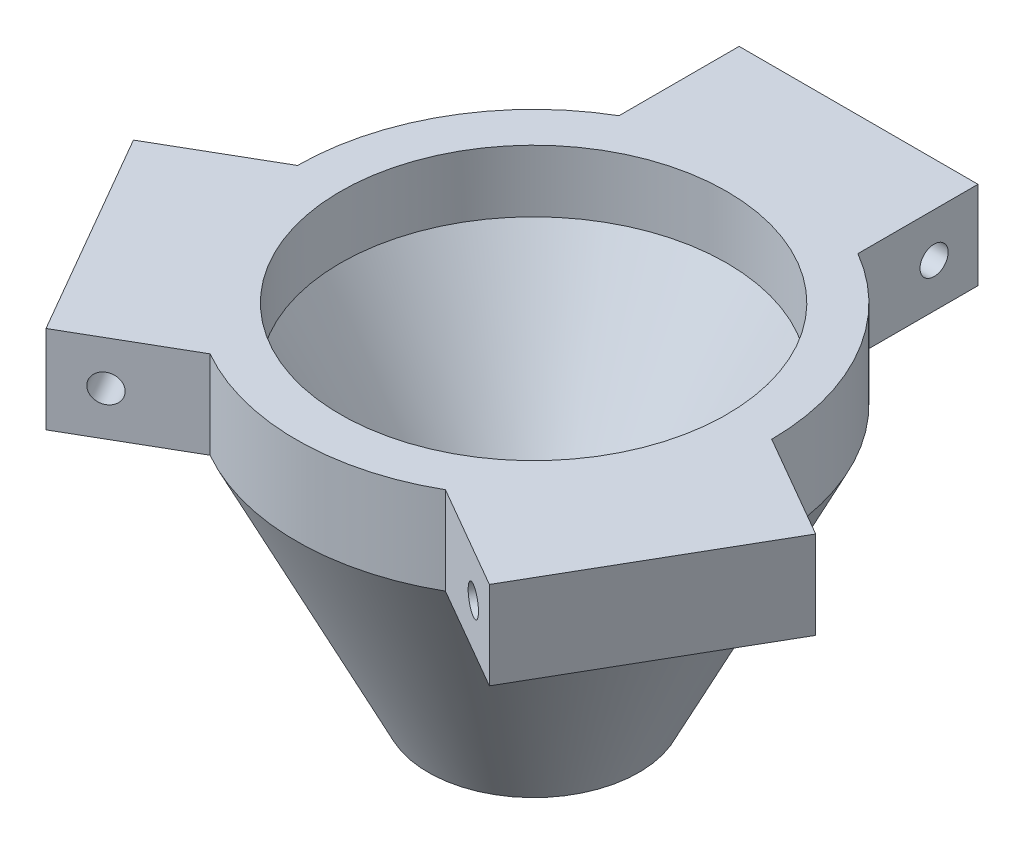
ISO-10303-21;
HEADER;
FILE_DESCRIPTION(('STEP AP214'),'2;1');
FILE_NAME('part.step','',(''),(''),'','','');
FILE_SCHEMA(('AUTOMOTIVE_DESIGN { 1 0 10303 214 1 1 1 1 }'));
ENDSEC;
DATA;
#1=APPLICATION_CONTEXT('core data for automotive mechanical design processes');
#2=APPLICATION_PROTOCOL_DEFINITION('international standard','automotive_design',2000,#1);
#3=PRODUCT_CONTEXT('',#1,'mechanical');
#4=PRODUCT('Part','Part','',(#3));
#5=PRODUCT_RELATED_PRODUCT_CATEGORY('part','',(#4));
#6=PRODUCT_DEFINITION_FORMATION('','',#4);
#7=PRODUCT_DEFINITION_CONTEXT('part definition',#1,'design');
#8=PRODUCT_DEFINITION('design','',#6,#7);
#9=PRODUCT_DEFINITION_SHAPE('','',#8);
#10=(LENGTH_UNIT() NAMED_UNIT(*) SI_UNIT(.MILLI.,.METRE.));
#11=(NAMED_UNIT(*) PLANE_ANGLE_UNIT() SI_UNIT($,.RADIAN.));
#12=(NAMED_UNIT(*) SI_UNIT($,.STERADIAN.) SOLID_ANGLE_UNIT());
#13=UNCERTAINTY_MEASURE_WITH_UNIT(LENGTH_MEASURE(1.E-05),#10,'distance_accuracy_value','');
#14=(GEOMETRIC_REPRESENTATION_CONTEXT(3) GLOBAL_UNCERTAINTY_ASSIGNED_CONTEXT((#13)) GLOBAL_UNIT_ASSIGNED_CONTEXT((#10,
#11,#12)) REPRESENTATION_CONTEXT('',''));
#15=CARTESIAN_POINT('',(0.,0.,0.));
#16=DIRECTION('',(0.,0.,1.));
#17=DIRECTION('',(1.,0.,0.));
#18=AXIS2_PLACEMENT_3D('',#15,#16,#17);
#19=CARTESIAN_POINT('',(0.,0.,0.));
#20=DIRECTION('',(0.,-1.,0.));
#21=DIRECTION('',(0.,0.,-1.));
#22=AXIS2_PLACEMENT_3D('',#19,#20,#21);
#23=CYLINDRICAL_SURFACE('',#22,27.);
#24=CARTESIAN_POINT('',(0.,40.3,0.));
#25=DIRECTION('',(0.,-1.,0.));
#26=DIRECTION('',(0.,0.,-1.));
#27=AXIS2_PLACEMENT_3D('',#24,#25,#26);
#28=CIRCLE('',#27,27.);
#29=CARTESIAN_POINT('',(13.3997524737308,40.3,23.4402780197408));
#30=VERTEX_POINT('',#29);
#31=CARTESIAN_POINT('',(-13.3997524737312,40.3,23.4402780197406));
#32=VERTEX_POINT('',#31);
#33=EDGE_CURVE('E219',#30,#32,#28,.T.);
#34=ORIENTED_EDGE('',*,*,#33,.T.);
#35=DIRECTION('',(0.,-1.,0.));
#36=VECTOR('',#35,1.);
#37=CARTESIAN_POINT('',(-13.3997524737312,0.,23.4402780197406));
#38=LINE('',#37,#36);
#39=CARTESIAN_POINT('',(-13.3997524737312,30.3,23.4402780197406));
#40=VERTEX_POINT('',#39);
#41=EDGE_CURVE('E73',#32,#40,#38,.T.);
#42=ORIENTED_EDGE('',*,*,#41,.T.);
#43=CARTESIAN_POINT('',(0.,30.3,0.));
#44=DIRECTION('',(0.,-1.,0.));
#45=DIRECTION('',(0.,0.,-1.));
#46=AXIS2_PLACEMENT_3D('',#43,#44,#45);
#47=CIRCLE('',#46,27.);
#48=CARTESIAN_POINT('',(13.3997524737308,30.3,23.4402780197408));
#49=VERTEX_POINT('',#48);
#50=EDGE_CURVE('E323',#49,#40,#47,.T.);
#51=ORIENTED_EDGE('',*,*,#50,.F.);
#52=DIRECTION('',(0.,-1.,0.));
#53=VECTOR('',#52,1.);
#54=CARTESIAN_POINT('',(13.3997524737308,0.,23.4402780197408));
#55=LINE('',#54,#53);
#56=EDGE_CURVE('E244',#49,#30,#55,.F.);
#57=ORIENTED_EDGE('',*,*,#56,.T.);
#58=EDGE_LOOP('',(#34,#42,#51,#57));
#59=FACE_BOUND('',#58,.T.);
#60=ADVANCED_FACE('F48',(#59),#23,.T.);
#61=CARTESIAN_POINT('',(13.6,40.3,-23.3246650565448));
#62=VERTEX_POINT('',#61);
#63=CARTESIAN_POINT('',(26.999752473731,40.3,-0.115612963195866));
#64=VERTEX_POINT('',#63);
#65=EDGE_CURVE('E187',#62,#64,#28,.T.);
#66=ORIENTED_EDGE('',*,*,#65,.T.);
#67=DIRECTION('',(0.,-1.,0.));
#68=VECTOR('',#67,1.);
#69=CARTESIAN_POINT('',(26.999752473731,0.,-0.115612963195866));
#70=LINE('',#69,#68);
#71=CARTESIAN_POINT('',(26.999752473731,30.3,-0.115612963195866));
#72=VERTEX_POINT('',#71);
#73=EDGE_CURVE('E249',#64,#72,#70,.T.);
#74=ORIENTED_EDGE('',*,*,#73,.T.);
#75=CARTESIAN_POINT('',(13.6,30.3,-23.3246650565448));
#76=VERTEX_POINT('',#75);
#77=EDGE_CURVE('E181',#76,#72,#47,.T.);
#78=ORIENTED_EDGE('',*,*,#77,.F.);
#79=DIRECTION('',(0.,-1.,0.));
#80=VECTOR('',#79,1.);
#81=CARTESIAN_POINT('',(13.6,0.,-23.3246650565448));
#82=LINE('',#81,#80);
#83=EDGE_CURVE('E269',#76,#62,#82,.F.);
#84=ORIENTED_EDGE('',*,*,#83,.T.);
#85=EDGE_LOOP('',(#66,#74,#78,#84));
#86=FACE_BOUND('',#85,.T.);
#87=ADVANCED_FACE('F300',(#86),#23,.T.);
#88=CARTESIAN_POINT('',(0.,0.,0.));
#89=DIRECTION('',(0.,-1.,0.));
#90=DIRECTION('',(0.,0.,-1.));
#91=AXIS2_PLACEMENT_3D('',#88,#89,#90);
#92=CYLINDRICAL_SURFACE('',#91,6.);
#93=CARTESIAN_POINT('',(0.,7.25479393551143,0.));
#94=DIRECTION('',(0.,-1.,0.));
#95=DIRECTION('',(0.,0.,-1.));
#96=AXIS2_PLACEMENT_3D('',#93,#94,#95);
#97=CIRCLE('',#96,6.);
#98=CARTESIAN_POINT('',(0.,7.25479393551143,6.));
#99=VERTEX_POINT('',#98);
#100=EDGE_CURVE('E276',#99,#99,#97,.T.);
#101=ORIENTED_EDGE('',*,*,#100,.F.);
#102=EDGE_LOOP('',(#101));
#103=FACE_BOUND('',#102,.T.);
#104=CARTESIAN_POINT('',(0.,0.,0.));
#105=DIRECTION('',(0.,-1.,0.));
#106=DIRECTION('',(0.,0.,-1.));
#107=AXIS2_PLACEMENT_3D('',#104,#105,#106);
#108=CIRCLE('',#107,6.);
#109=CARTESIAN_POINT('',(0.,0.,-6.));
#110=VERTEX_POINT('',#109);
#111=EDGE_CURVE('E12',#110,#110,#108,.T.);
#112=ORIENTED_EDGE('',*,*,#111,.T.);
#113=EDGE_LOOP('',(#112));
#114=FACE_BOUND('',#113,.T.);
#115=ADVANCED_FACE('F50',(#103,#114),#92,.F.);
#116=CARTESIAN_POINT('',(-6.,0.,0.));
#117=DIRECTION('',(0.,1.,0.));
#118=DIRECTION('',(0.,0.,1.));
#119=AXIS2_PLACEMENT_3D('',#116,#117,#118);
#120=PLANE('',#119);
#121=ORIENTED_EDGE('',*,*,#111,.F.);
#122=EDGE_LOOP('',(#121));
#123=FACE_BOUND('',#122,.T.);
#124=CARTESIAN_POINT('',(0.,0.,0.));
#125=DIRECTION('',(0.,-1.,0.));
#126=DIRECTION('',(0.,0.,-1.));
#127=AXIS2_PLACEMENT_3D('',#124,#125,#126);
#128=CIRCLE('',#127,12.);
#129=CARTESIAN_POINT('',(0.,0.,-12.));
#130=VERTEX_POINT('',#129);
#131=EDGE_CURVE('E57',#130,#130,#128,.T.);
#132=ORIENTED_EDGE('',*,*,#131,.T.);
#133=EDGE_LOOP('',(#132));
#134=FACE_BOUND('',#133,.T.);
#135=ADVANCED_FACE('F299',(#123,#134),#120,.F.);
#136=CARTESIAN_POINT('',(0.,30.3,0.));
#137=DIRECTION('',(0.,1.,0.));
#138=DIRECTION('',(0.,0.,1.));
#139=AXIS2_PLACEMENT_3D('',#136,#137,#138);
#140=CONICAL_SURFACE('',#139,27.,0.459679375861773);
#141=ORIENTED_EDGE('',*,*,#131,.F.);
#142=EDGE_LOOP('',(#141));
#143=FACE_BOUND('',#142,.T.);
#144=ORIENTED_EDGE('',*,*,#77,.T.);
#145=EDGE_CURVE('E185',#72,#49,#47,.T.);
#146=ORIENTED_EDGE('',*,*,#145,.T.);
#147=ORIENTED_EDGE('',*,*,#50,.T.);
#148=CARTESIAN_POINT('',(-26.999752473731,30.3,-0.115612963196236));
#149=VERTEX_POINT('',#148);
#150=EDGE_CURVE('E336',#40,#149,#47,.T.);
#151=ORIENTED_EDGE('',*,*,#150,.T.);
#152=CARTESIAN_POINT('',(-13.6,30.3,-23.3246650565448));
#153=VERTEX_POINT('',#152);
#154=EDGE_CURVE('E65',#149,#153,#47,.T.);
#155=ORIENTED_EDGE('',*,*,#154,.T.);
#156=EDGE_CURVE('E186',#153,#76,#47,.T.);
#157=ORIENTED_EDGE('',*,*,#156,.T.);
#158=EDGE_LOOP('',(#144,#146,#147,#151,#155,#157));
#159=FACE_BOUND('',#158,.T.);
#160=ADVANCED_FACE('F305',(#143,#159),#140,.T.);
#161=ORIENTED_EDGE('',*,*,#154,.F.);
#162=DIRECTION('',(0.,-1.,0.));
#163=VECTOR('',#162,1.);
#164=CARTESIAN_POINT('',(-26.999752473731,0.,-0.115612963196237));
#165=LINE('',#164,#163);
#166=CARTESIAN_POINT('',(-26.999752473731,40.3,-0.115612963196233));
#167=VERTEX_POINT('',#166);
#168=EDGE_CURVE('E147',#149,#167,#165,.F.);
#169=ORIENTED_EDGE('',*,*,#168,.T.);
#170=CARTESIAN_POINT('',(-13.6,40.3,-23.3246650565448));
#171=VERTEX_POINT('',#170);
#172=EDGE_CURVE('E215',#167,#171,#28,.T.);
#173=ORIENTED_EDGE('',*,*,#172,.T.);
#174=DIRECTION('',(0.,-1.,0.));
#175=VECTOR('',#174,1.);
#176=CARTESIAN_POINT('',(-13.6,0.,-23.3246650565448));
#177=LINE('',#176,#175);
#178=EDGE_CURVE('E274',#171,#153,#177,.T.);
#179=ORIENTED_EDGE('',*,*,#178,.T.);
#180=EDGE_LOOP('',(#161,#169,#173,#179));
#181=FACE_BOUND('',#180,.T.);
#182=ADVANCED_FACE('F221',(#181),#23,.T.);
#183=CARTESIAN_POINT('',(-27.,40.3,0.));
#184=DIRECTION('',(0.,-1.,0.));
#185=DIRECTION('',(0.,0.,-1.));
#186=AXIS2_PLACEMENT_3D('',#183,#184,#185);
#187=PLANE('',#186);
#188=ORIENTED_EDGE('',*,*,#172,.F.);
#189=DIRECTION('',(-0.866025403784443,0.,0.499999999999992));
#190=VECTOR('',#189,1.);
#191=CARTESIAN_POINT('',(-38.8429399400243,40.3,6.72205450853127));
#192=LINE('',#191,#190);
#193=CARTESIAN_POINT('',(-38.8429399400243,40.3,6.72205450853127));
#194=VERTEX_POINT('',#193);
#195=EDGE_CURVE('E170',#167,#194,#192,.T.);
#196=ORIENTED_EDGE('',*,*,#195,.T.);
#197=DIRECTION('',(0.499999999999992,0.,0.866025403784443));
#198=VECTOR('',#197,1.);
#199=CARTESIAN_POINT('',(-25.2429399400245,40.3,30.2779454914681));
#200=LINE('',#199,#198);
#201=CARTESIAN_POINT('',(-25.2429399400245,40.3,30.2779454914681));
#202=VERTEX_POINT('',#201);
#203=EDGE_CURVE('E158',#194,#202,#200,.T.);
#204=ORIENTED_EDGE('',*,*,#203,.T.);
#205=DIRECTION('',(0.866025403784443,0.,-0.499999999999992));
#206=VECTOR('',#205,1.);
#207=CARTESIAN_POINT('',(-25.2429399400245,40.3,30.2779454914681));
#208=LINE('',#207,#206);
#209=EDGE_CURVE('E167',#202,#32,#208,.T.);
#210=ORIENTED_EDGE('',*,*,#209,.T.);
#211=ORIENTED_EDGE('',*,*,#33,.F.);
#212=DIRECTION('',(0.866025403784436,0.,0.500000000000004));
#213=VECTOR('',#212,1.);
#214=CARTESIAN_POINT('',(25.2429399400241,40.3,30.2779454914685));
#215=LINE('',#214,#213);
#216=CARTESIAN_POINT('',(25.2429399400241,40.3,30.2779454914685));
#217=VERTEX_POINT('',#216);
#218=EDGE_CURVE('E238',#30,#217,#215,.T.);
#219=ORIENTED_EDGE('',*,*,#218,.T.);
#220=DIRECTION('',(0.500000000000004,0.,-0.866025403784436));
#221=VECTOR('',#220,1.);
#222=CARTESIAN_POINT('',(38.8429399400242,40.3,6.72205450853182));
#223=LINE('',#222,#221);
#224=CARTESIAN_POINT('',(38.8429399400242,40.3,6.72205450853182));
#225=VERTEX_POINT('',#224);
#226=EDGE_CURVE('E230',#217,#225,#223,.T.);
#227=ORIENTED_EDGE('',*,*,#226,.T.);
#228=DIRECTION('',(-0.866025403784437,0.,-0.500000000000004));
#229=VECTOR('',#228,1.);
#230=CARTESIAN_POINT('',(38.8429399400242,40.3,6.72205450853182));
#231=LINE('',#230,#229);
#232=EDGE_CURVE('E223',#225,#64,#231,.T.);
#233=ORIENTED_EDGE('',*,*,#232,.T.);
#234=ORIENTED_EDGE('',*,*,#65,.F.);
#235=DIRECTION('',(0.,0.,-1.));
#236=VECTOR('',#235,1.);
#237=CARTESIAN_POINT('',(13.6,40.3,-37.));
#238=LINE('',#237,#236);
#239=CARTESIAN_POINT('',(13.6,40.3,-37.));
#240=VERTEX_POINT('',#239);
#241=EDGE_CURVE('E264',#62,#240,#238,.T.);
#242=ORIENTED_EDGE('',*,*,#241,.T.);
#243=DIRECTION('',(-1.,0.,0.));
#244=VECTOR('',#243,1.);
#245=CARTESIAN_POINT('',(-13.6,40.3,-37.));
#246=LINE('',#245,#244);
#247=CARTESIAN_POINT('',(-13.6,40.3,-37.));
#248=VERTEX_POINT('',#247);
#249=EDGE_CURVE('E257',#240,#248,#246,.T.);
#250=ORIENTED_EDGE('',*,*,#249,.T.);
#251=DIRECTION('',(0.,0.,1.));
#252=VECTOR('',#251,1.);
#253=CARTESIAN_POINT('',(-13.6,40.3,-37.));
#254=LINE('',#253,#252);
#255=EDGE_CURVE('E195',#248,#171,#254,.T.);
#256=ORIENTED_EDGE('',*,*,#255,.T.);
#257=EDGE_LOOP('',(#188,#196,#204,#210,#211,#219,#227,#233,#234,#242,#250,#256));
#258=FACE_BOUND('',#257,.T.);
#259=CARTESIAN_POINT('',(0.,40.3,0.));
#260=DIRECTION('',(0.,-1.,0.));
#261=DIRECTION('',(0.,0.,-1.));
#262=AXIS2_PLACEMENT_3D('',#259,#260,#261);
#263=CIRCLE('',#262,22.);
#264=CARTESIAN_POINT('',(0.,40.3,-22.));
#265=VERTEX_POINT('',#264);
#266=EDGE_CURVE('E220',#265,#265,#263,.T.);
#267=ORIENTED_EDGE('',*,*,#266,.T.);
#268=EDGE_LOOP('',(#267));
#269=FACE_BOUND('',#268,.T.);
#270=ADVANCED_FACE('F212',(#258,#269),#187,.F.);
#271=CARTESIAN_POINT('',(0.,0.,0.));
#272=DIRECTION('',(0.,-1.,0.));
#273=DIRECTION('',(0.,0.,-1.));
#274=AXIS2_PLACEMENT_3D('',#271,#272,#273);
#275=CYLINDRICAL_SURFACE('',#274,22.);
#276=ORIENTED_EDGE('',*,*,#266,.F.);
#277=EDGE_LOOP('',(#276));
#278=FACE_BOUND('',#277,.T.);
#279=CARTESIAN_POINT('',(0.,33.2371899423447,0.));
#280=DIRECTION('',(0.,-1.,0.));
#281=DIRECTION('',(0.,0.,-1.));
#282=AXIS2_PLACEMENT_3D('',#279,#280,#281);
#283=CIRCLE('',#282,22.);
#284=CARTESIAN_POINT('',(0.,33.2371899423447,22.));
#285=VERTEX_POINT('',#284);
#286=EDGE_CURVE('E279',#285,#285,#283,.T.);
#287=ORIENTED_EDGE('',*,*,#286,.T.);
#288=EDGE_LOOP('',(#287));
#289=FACE_BOUND('',#288,.T.);
#290=ADVANCED_FACE('F284',(#278,#289),#275,.F.);
#291=CARTESIAN_POINT('',(0.,7.25479393551143,0.));
#292=DIRECTION('',(0.,1.,0.));
#293=DIRECTION('',(0.,0.,1.));
#294=AXIS2_PLACEMENT_3D('',#291,#292,#293);
#295=CONICAL_SURFACE('',#294,6.,0.551957345484303);
#296=CARTESIAN_POINT('',(0.,33.2371899423447,22.));
#297=CARTESIAN_POINT('',(0.,32.9665399839402,21.8333333333333));
#298=CARTESIAN_POINT('',(0.,32.6958900255356,21.6666666666667));
#299=CARTESIAN_POINT('',(0.,32.1545901087266,21.3333333333333));
#300=CARTESIAN_POINT('',(0.,31.8839401503221,21.1666666666667));
#301=CARTESIAN_POINT('',(0.,31.3426402335131,20.8333333333333));
#302=CARTESIAN_POINT('',(0.,31.0719902751086,20.6666666666667));
#303=CARTESIAN_POINT('',(0.,30.5306903582995,20.3333333333333));
#304=CARTESIAN_POINT('',(0.,30.260040399895,20.1666666666667));
#305=CARTESIAN_POINT('',(0.,29.718740483086,19.8333333333333));
#306=CARTESIAN_POINT('',(0.,29.4480905246815,19.6666666666667));
#307=CARTESIAN_POINT('',(0.,28.9067906078725,19.3333333333333));
#308=CARTESIAN_POINT('',(0.,28.636140649468,19.1666666666667));
#309=CARTESIAN_POINT('',(0.,28.0948407326589,18.8333333333333));
#310=CARTESIAN_POINT('',(0.,27.8241907742544,18.6666666666667));
#311=CARTESIAN_POINT('',(0.,27.2828908574454,18.3333333333333));
#312=CARTESIAN_POINT('',(0.,27.0122408990409,18.1666666666667));
#313=CARTESIAN_POINT('',(0.,26.4709409822318,17.8333333333333));
#314=CARTESIAN_POINT('',(0.,26.2002910238273,17.6666666666667));
#315=CARTESIAN_POINT('',(0.,25.6589911070183,17.3333333333333));
#316=CARTESIAN_POINT('',(0.,25.3883411486138,17.1666666666667));
#317=CARTESIAN_POINT('',(0.,24.8470412318048,16.8333333333333));
#318=CARTESIAN_POINT('',(0.,24.5763912734003,16.6666666666667));
#319=CARTESIAN_POINT('',(0.,24.0350913565912,16.3333333333333));
#320=CARTESIAN_POINT('',(0.,23.7644413981867,16.1666666666667));
#321=CARTESIAN_POINT('',(0.,23.2231414813777,15.8333333333333));
#322=CARTESIAN_POINT('',(0.,22.9524915229732,15.6666666666667));
#323=CARTESIAN_POINT('',(0.,22.4111916061642,15.3333333333333));
#324=CARTESIAN_POINT('',(0.,22.1405416477596,15.1666666666667));
#325=CARTESIAN_POINT('',(0.,21.5992417309506,14.8333333333333));
#326=CARTESIAN_POINT('',(0.,21.3285917725461,14.6666666666667));
#327=CARTESIAN_POINT('',(0.,20.7872918557371,14.3333333333333));
#328=CARTESIAN_POINT('',(0.,20.5166418973326,14.1666666666667));
#329=CARTESIAN_POINT('',(0.,19.9753419805235,13.8333333333333));
#330=CARTESIAN_POINT('',(0.,19.704692022119,13.6666666666667));
#331=CARTESIAN_POINT('',(0.,19.16339210531,13.3333333333333));
#332=CARTESIAN_POINT('',(0.,18.8927421469055,13.1666666666667));
#333=CARTESIAN_POINT('',(0.,18.3514422300965,12.8333333333333));
#334=CARTESIAN_POINT('',(0.,18.0807922716919,12.6666666666667));
#335=CARTESIAN_POINT('',(0.,17.5394923548829,12.3333333333333));
#336=CARTESIAN_POINT('',(0.,17.2688423964784,12.1666666666667));
#337=CARTESIAN_POINT('',(0.,16.7275424796694,11.8333333333333));
#338=CARTESIAN_POINT('',(0.,16.4568925212649,11.6666666666667));
#339=CARTESIAN_POINT('',(0.,15.9155926044558,11.3333333333333));
#340=CARTESIAN_POINT('',(0.,15.6449426460513,11.1666666666667));
#341=CARTESIAN_POINT('',(0.,15.1036427292423,10.8333333333333));
#342=CARTESIAN_POINT('',(0.,14.8329927708378,10.6666666666667));
#343=CARTESIAN_POINT('',(0.,14.2916928540288,10.3333333333333));
#344=CARTESIAN_POINT('',(0.,14.0210428956242,10.1666666666667));
#345=CARTESIAN_POINT('',(0.,13.4797429788152,9.83333333333333));
#346=CARTESIAN_POINT('',(0.,13.2090930204107,9.66666666666667));
#347=CARTESIAN_POINT('',(0.,12.6677931036017,9.33333333333333));
#348=CARTESIAN_POINT('',(0.,12.3971431451972,9.16666666666667));
#349=CARTESIAN_POINT('',(0.,11.8558432283881,8.83333333333333));
#350=CARTESIAN_POINT('',(0.,11.5851932699836,8.66666666666667));
#351=CARTESIAN_POINT('',(0.,11.0438933531746,8.33333333333333));
#352=CARTESIAN_POINT('',(0.,10.7732433947701,8.16666666666667));
#353=CARTESIAN_POINT('',(0.,10.2319434779611,7.83333333333333));
#354=CARTESIAN_POINT('',(0.,9.96129351955655,7.66666666666667));
#355=CARTESIAN_POINT('',(0.,9.41999360274753,7.33333333333333));
#356=CARTESIAN_POINT('',(0.,9.14934364434302,7.16666666666667));
#357=CARTESIAN_POINT('',(0.,8.60804372753399,6.83333333333333));
#358=CARTESIAN_POINT('',(0.,8.33739376912948,6.66666666666667));
#359=CARTESIAN_POINT('',(0.,7.79609385232045,6.33333333333333));
#360=CARTESIAN_POINT('',(0.,7.52544389391594,6.16666666666667));
#361=CARTESIAN_POINT('',(0.,7.25479393551143,6.));
#362=B_SPLINE_CURVE_WITH_KNOTS('',3,(#296,#297,#298,#299,#300,#301,#302,#303,#304,#305,#306,
#307,#308,#309,#310,#311,#312,#313,#314,#315,#316,#317,#318,#319,#320,#321,#322,#323,#324,#325,
#326,#327,#328,#329,#330,#331,#332,#333,#334,#335,#336,#337,#338,#339,#340,#341,#342,#343,#344,
#345,#346,#347,#348,#349,#350,#351,#352,#353,#354,#355,#356,#357,#358,#359,#360,#361),
.UNSPECIFIED.,.F.,.F.,(4,2,2,2,2,2,2,2,2,2,2,2,2,2,2,2,2,2,2,2,2,2,2,2,2,2,2,2,2,2,2,2,4),(0.,
0.953552620393486,1.90710524078697,2.86065786118046,3.81421048157394,4.76776310196743,
5.72131572236091,6.67486834275439,7.62842096314788,8.58197358354137,9.53552620393485,
10.4890788243283,11.4426314447218,12.3961840651153,13.3497366855088,14.3032893059023,
15.2568419262958,16.2103945466892,17.1639471670827,18.1174997874762,19.0710524078697,
20.0246050282632,20.9781576486567,21.9317102690502,22.8852628894436,23.8388155098371,
24.7923681302306,25.7459207506241,26.6994733710176,27.6530259914111,28.6065786118046,
29.560131232198,30.5136838525915),.UNSPECIFIED.);
#363=EDGE_CURVE('BSEAM287',#285,#99,#362,.T.);
#364=ORIENTED_EDGE('',*,*,#286,.F.);
#365=ORIENTED_EDGE('',*,*,#100,.T.);
#366=ORIENTED_EDGE('',*,*,#363,.T.);
#367=ORIENTED_EDGE('',*,*,#363,.F.);
#368=EDGE_LOOP('',(#364,#366,#365,#367));
#369=FACE_BOUND('',#368,.T.);
#370=ADVANCED_FACE('F287',(#369),#295,.F.);
#371=CARTESIAN_POINT('',(0.,30.3,0.));
#372=DIRECTION('',(0.,1.,0.));
#373=DIRECTION('',(0.,0.,1.));
#374=AXIS2_PLACEMENT_3D('',#371,#372,#373);
#375=PLANE('',#374);
#376=DIRECTION('',(0.,0.,-1.));
#377=VECTOR('',#376,1.);
#378=CARTESIAN_POINT('',(13.6,30.3,-37.));
#379=LINE('',#378,#377);
#380=CARTESIAN_POINT('',(13.6,30.3,-37.));
#381=VERTEX_POINT('',#380);
#382=EDGE_CURVE('E256',#76,#381,#379,.T.);
#383=ORIENTED_EDGE('',*,*,#382,.F.);
#384=ORIENTED_EDGE('',*,*,#156,.F.);
#385=DIRECTION('',(0.,0.,1.));
#386=VECTOR('',#385,1.);
#387=CARTESIAN_POINT('',(-13.6,30.3,-37.));
#388=LINE('',#387,#386);
#389=CARTESIAN_POINT('',(-13.6,30.3,-37.));
#390=VERTEX_POINT('',#389);
#391=EDGE_CURVE('E253',#390,#153,#388,.T.);
#392=ORIENTED_EDGE('',*,*,#391,.F.);
#393=DIRECTION('',(-1.,0.,0.));
#394=VECTOR('',#393,1.);
#395=CARTESIAN_POINT('',(-13.6,30.3,-37.));
#396=LINE('',#395,#394);
#397=EDGE_CURVE('E259',#381,#390,#396,.T.);
#398=ORIENTED_EDGE('',*,*,#397,.F.);
#399=EDGE_LOOP('',(#383,#384,#392,#398));
#400=FACE_BOUND('',#399,.T.);
#401=ADVANCED_FACE('F293',(#400),#375,.F.);
#402=CARTESIAN_POINT('',(-13.6,30.3,-37.));
#403=DIRECTION('',(-1.,0.,0.));
#404=DIRECTION('',(0.,0.,1.));
#405=AXIS2_PLACEMENT_3D('',#402,#403,#404);
#406=PLANE('',#405);
#407=CARTESIAN_POINT('',(-13.6,35.3,-32.));
#408=DIRECTION('',(-1.,0.,0.));
#409=DIRECTION('',(0.,0.,1.));
#410=AXIS2_PLACEMENT_3D('',#407,#408,#409);
#411=CIRCLE('',#410,1.6);
#412=CARTESIAN_POINT('',(-13.6,35.3,-30.4));
#413=VERTEX_POINT('',#412);
#414=EDGE_CURVE('E196',#413,#413,#411,.T.);
#415=ORIENTED_EDGE('',*,*,#414,.F.);
#416=EDGE_LOOP('',(#415));
#417=FACE_BOUND('',#416,.T.);
#418=ORIENTED_EDGE('',*,*,#178,.F.);
#419=ORIENTED_EDGE('',*,*,#255,.F.);
#420=DIRECTION('',(0.,1.,0.));
#421=VECTOR('',#420,1.);
#422=CARTESIAN_POINT('',(-13.6,30.3,-37.));
#423=LINE('',#422,#421);
#424=EDGE_CURVE('E267',#390,#248,#423,.T.);
#425=ORIENTED_EDGE('',*,*,#424,.F.);
#426=ORIENTED_EDGE('',*,*,#391,.T.);
#427=EDGE_LOOP('',(#418,#419,#425,#426));
#428=FACE_BOUND('',#427,.T.);
#429=ADVANCED_FACE('F348',(#417,#428),#406,.T.);
#430=CARTESIAN_POINT('',(13.6,30.3,-37.));
#431=DIRECTION('',(1.,0.,0.));
#432=DIRECTION('',(0.,0.,-1.));
#433=AXIS2_PLACEMENT_3D('',#430,#431,#432);
#434=PLANE('',#433);
#435=CARTESIAN_POINT('',(13.6,35.3,-32.));
#436=DIRECTION('',(1.,0.,0.));
#437=DIRECTION('',(0.,0.,-1.));
#438=AXIS2_PLACEMENT_3D('',#435,#436,#437);
#439=CIRCLE('',#438,1.6);
#440=CARTESIAN_POINT('',(13.6,35.3,-33.6));
#441=VERTEX_POINT('',#440);
#442=EDGE_CURVE('E193',#441,#441,#439,.T.);
#443=ORIENTED_EDGE('',*,*,#442,.F.);
#444=EDGE_LOOP('',(#443));
#445=FACE_BOUND('',#444,.T.);
#446=ORIENTED_EDGE('',*,*,#83,.F.);
#447=ORIENTED_EDGE('',*,*,#382,.T.);
#448=DIRECTION('',(0.,1.,0.));
#449=VECTOR('',#448,1.);
#450=CARTESIAN_POINT('',(13.6,30.3,-37.));
#451=LINE('',#450,#449);
#452=EDGE_CURVE('E262',#381,#240,#451,.T.);
#453=ORIENTED_EDGE('',*,*,#452,.T.);
#454=ORIENTED_EDGE('',*,*,#241,.F.);
#455=EDGE_LOOP('',(#446,#447,#453,#454));
#456=FACE_BOUND('',#455,.T.);
#457=ADVANCED_FACE('F341',(#445,#456),#434,.T.);
#458=CARTESIAN_POINT('',(-13.6,30.3,-37.));
#459=DIRECTION('',(0.,0.,-1.));
#460=DIRECTION('',(-1.,0.,0.));
#461=AXIS2_PLACEMENT_3D('',#458,#459,#460);
#462=PLANE('',#461);
#463=ORIENTED_EDGE('',*,*,#249,.F.);
#464=ORIENTED_EDGE('',*,*,#452,.F.);
#465=ORIENTED_EDGE('',*,*,#397,.T.);
#466=ORIENTED_EDGE('',*,*,#424,.T.);
#467=EDGE_LOOP('',(#463,#464,#465,#466));
#468=FACE_BOUND('',#467,.T.);
#469=ADVANCED_FACE('F345',(#468),#462,.T.);
#470=CARTESIAN_POINT('',(27.,35.3,-32.));
#471=DIRECTION('',(-1.,0.,0.));
#472=DIRECTION('',(0.,0.,1.));
#473=AXIS2_PLACEMENT_3D('',#470,#471,#472);
#474=CYLINDRICAL_SURFACE('',#473,1.6);
#475=ORIENTED_EDGE('',*,*,#442,.T.);
#476=EDGE_LOOP('',(#475));
#477=FACE_BOUND('',#476,.T.);
#478=ORIENTED_EDGE('',*,*,#414,.T.);
#479=EDGE_LOOP('',(#478));
#480=FACE_BOUND('',#479,.T.);
#481=ADVANCED_FACE('F375',(#477,#480),#474,.F.);
#482=CARTESIAN_POINT('',(0.,30.3,0.));
#483=DIRECTION('',(0.,1.,0.));
#484=DIRECTION('',(-0.866025403784436,0.,-0.500000000000004));
#485=AXIS2_PLACEMENT_3D('',#482,#483,#484);
#486=PLANE('',#485);
#487=DIRECTION('',(0.866025403784436,0.,0.500000000000004));
#488=VECTOR('',#487,1.);
#489=CARTESIAN_POINT('',(25.2429399400241,30.3,30.2779454914685));
#490=LINE('',#489,#488);
#491=CARTESIAN_POINT('',(25.2429399400241,30.3,30.2779454914685));
#492=VERTEX_POINT('',#491);
#493=EDGE_CURVE('E229',#49,#492,#490,.T.);
#494=ORIENTED_EDGE('',*,*,#493,.F.);
#495=ORIENTED_EDGE('',*,*,#145,.F.);
#496=DIRECTION('',(-0.866025403784437,0.,-0.500000000000004));
#497=VECTOR('',#496,1.);
#498=CARTESIAN_POINT('',(38.8429399400242,30.3,6.72205450853182));
#499=LINE('',#498,#497);
#500=CARTESIAN_POINT('',(38.8429399400242,30.3,6.72205450853182));
#501=VERTEX_POINT('',#500);
#502=EDGE_CURVE('E226',#501,#72,#499,.T.);
#503=ORIENTED_EDGE('',*,*,#502,.F.);
#504=DIRECTION('',(0.500000000000004,0.,-0.866025403784436));
#505=VECTOR('',#504,1.);
#506=CARTESIAN_POINT('',(38.8429399400242,30.3,6.72205450853182));
#507=LINE('',#506,#505);
#508=EDGE_CURVE('E232',#492,#501,#507,.T.);
#509=ORIENTED_EDGE('',*,*,#508,.F.);
#510=EDGE_LOOP('',(#494,#495,#503,#509));
#511=FACE_BOUND('',#510,.T.);
#512=ADVANCED_FACE('F321',(#511),#486,.F.);
#513=CARTESIAN_POINT('',(38.8429399400242,30.3,6.72205450853182));
#514=DIRECTION('',(0.500000000000004,0.,-0.866025403784436));
#515=DIRECTION('',(-0.866025403784436,0.,-0.500000000000004));
#516=AXIS2_PLACEMENT_3D('',#513,#514,#515);
#517=PLANE('',#516);
#518=CARTESIAN_POINT('',(34.512812921102,35.3,4.2220545085318));
#519=DIRECTION('',(0.500000000000004,0.,-0.866025403784436));
#520=DIRECTION('',(-0.866025403784436,0.,-0.500000000000004));
#521=AXIS2_PLACEMENT_3D('',#518,#519,#520);
#522=CIRCLE('',#521,1.6);
#523=CARTESIAN_POINT('',(33.1271722750469,35.3,3.42205450853179));
#524=VERTEX_POINT('',#523);
#525=EDGE_CURVE('E198',#524,#524,#522,.T.);
#526=ORIENTED_EDGE('',*,*,#525,.F.);
#527=EDGE_LOOP('',(#526));
#528=FACE_BOUND('',#527,.T.);
#529=ORIENTED_EDGE('',*,*,#73,.F.);
#530=ORIENTED_EDGE('',*,*,#232,.F.);
#531=DIRECTION('',(0.,1.,0.));
#532=VECTOR('',#531,1.);
#533=CARTESIAN_POINT('',(38.8429399400242,30.3,6.72205450853182));
#534=LINE('',#533,#532);
#535=EDGE_CURVE('E242',#501,#225,#534,.T.);
#536=ORIENTED_EDGE('',*,*,#535,.F.);
#537=ORIENTED_EDGE('',*,*,#502,.T.);
#538=EDGE_LOOP('',(#529,#530,#536,#537));
#539=FACE_BOUND('',#538,.T.);
#540=ADVANCED_FACE('F326',(#528,#539),#517,.T.);
#541=CARTESIAN_POINT('',(25.2429399400241,30.3,30.2779454914685));
#542=DIRECTION('',(-0.500000000000004,0.,0.866025403784436));
#543=DIRECTION('',(0.866025403784436,0.,0.500000000000004));
#544=AXIS2_PLACEMENT_3D('',#541,#542,#543);
#545=PLANE('',#544);
#546=CARTESIAN_POINT('',(20.9128129211019,35.3,27.7779454914685));
#547=DIRECTION('',(-0.500000000000004,0.,0.866025403784436));
#548=DIRECTION('',(0.866025403784436,0.,0.500000000000004));
#549=AXIS2_PLACEMENT_3D('',#546,#547,#548);
#550=CIRCLE('',#549,1.6);
#551=CARTESIAN_POINT('',(22.298453567157,35.3,28.5779454914685));
#552=VERTEX_POINT('',#551);
#553=EDGE_CURVE('E171',#552,#552,#550,.T.);
#554=ORIENTED_EDGE('',*,*,#553,.F.);
#555=EDGE_LOOP('',(#554));
#556=FACE_BOUND('',#555,.T.);
#557=ORIENTED_EDGE('',*,*,#56,.F.);
#558=ORIENTED_EDGE('',*,*,#493,.T.);
#559=DIRECTION('',(0.,1.,0.));
#560=VECTOR('',#559,1.);
#561=CARTESIAN_POINT('',(25.2429399400241,30.3,30.2779454914685));
#562=LINE('',#561,#560);
#563=EDGE_CURVE('E235',#492,#217,#562,.T.);
#564=ORIENTED_EDGE('',*,*,#563,.T.);
#565=ORIENTED_EDGE('',*,*,#218,.F.);
#566=EDGE_LOOP('',(#557,#558,#564,#565));
#567=FACE_BOUND('',#566,.T.);
#568=ADVANCED_FACE('F334',(#556,#567),#545,.T.);
#569=CARTESIAN_POINT('',(38.8429399400242,30.3,6.72205450853182));
#570=DIRECTION('',(0.866025403784436,0.,0.500000000000004));
#571=DIRECTION('',(0.500000000000004,0.,-0.866025403784436));
#572=AXIS2_PLACEMENT_3D('',#569,#570,#571);
#573=PLANE('',#572);
#574=ORIENTED_EDGE('',*,*,#226,.F.);
#575=ORIENTED_EDGE('',*,*,#563,.F.);
#576=ORIENTED_EDGE('',*,*,#508,.T.);
#577=ORIENTED_EDGE('',*,*,#535,.T.);
#578=EDGE_LOOP('',(#574,#575,#576,#577));
#579=FACE_BOUND('',#578,.T.);
#580=ADVANCED_FACE('F330',(#579),#573,.T.);
#581=CARTESIAN_POINT('',(0.,30.3,0.));
#582=DIRECTION('',(0.,1.,0.));
#583=DIRECTION('',(0.866025403784443,0.,-0.499999999999992));
#584=AXIS2_PLACEMENT_3D('',#581,#582,#583);
#585=PLANE('',#584);
#586=DIRECTION('',(-0.866025403784443,0.,0.499999999999992));
#587=VECTOR('',#586,1.);
#588=CARTESIAN_POINT('',(-38.8429399400243,30.3,6.72205450853127));
#589=LINE('',#588,#587);
#590=CARTESIAN_POINT('',(-38.8429399400243,30.3,6.72205450853127));
#591=VERTEX_POINT('',#590);
#592=EDGE_CURVE('E141',#149,#591,#589,.T.);
#593=ORIENTED_EDGE('',*,*,#592,.F.);
#594=ORIENTED_EDGE('',*,*,#150,.F.);
#595=DIRECTION('',(0.866025403784443,0.,-0.499999999999992));
#596=VECTOR('',#595,1.);
#597=CARTESIAN_POINT('',(-25.2429399400245,30.3,30.2779454914681));
#598=LINE('',#597,#596);
#599=CARTESIAN_POINT('',(-25.2429399400245,30.3,30.2779454914681));
#600=VERTEX_POINT('',#599);
#601=EDGE_CURVE('E152',#600,#40,#598,.T.);
#602=ORIENTED_EDGE('',*,*,#601,.F.);
#603=DIRECTION('',(0.499999999999992,0.,0.866025403784443));
#604=VECTOR('',#603,1.);
#605=CARTESIAN_POINT('',(-25.2429399400245,30.3,30.2779454914681));
#606=LINE('',#605,#604);
#607=EDGE_CURVE('E151',#591,#600,#606,.T.);
#608=ORIENTED_EDGE('',*,*,#607,.F.);
#609=EDGE_LOOP('',(#593,#594,#602,#608));
#610=FACE_BOUND('',#609,.T.);
#611=ADVANCED_FACE('F162',(#610),#585,.F.);
#612=CARTESIAN_POINT('',(-25.2429399400245,30.3,30.2779454914681));
#613=DIRECTION('',(0.499999999999992,0.,0.866025403784443));
#614=DIRECTION('',(0.866025403784443,0.,-0.499999999999992));
#615=AXIS2_PLACEMENT_3D('',#612,#613,#614);
#616=PLANE('',#615);
#617=CARTESIAN_POINT('',(-20.9128129211023,35.3,27.7779454914682));
#618=DIRECTION('',(0.499999999999992,0.,0.866025403784443));
#619=DIRECTION('',(0.866025403784443,0.,-0.499999999999992));
#620=AXIS2_PLACEMENT_3D('',#617,#618,#619);
#621=CIRCLE('',#620,1.6);
#622=CARTESIAN_POINT('',(-19.5271722750472,35.3,26.9779454914682));
#623=VERTEX_POINT('',#622);
#624=EDGE_CURVE('E206',#623,#623,#621,.T.);
#625=ORIENTED_EDGE('',*,*,#624,.F.);
#626=EDGE_LOOP('',(#625));
#627=FACE_BOUND('',#626,.T.);
#628=ORIENTED_EDGE('',*,*,#41,.F.);
#629=ORIENTED_EDGE('',*,*,#209,.F.);
#630=DIRECTION('',(0.,1.,0.));
#631=VECTOR('',#630,1.);
#632=CARTESIAN_POINT('',(-25.2429399400245,30.3,30.2779454914681));
#633=LINE('',#632,#631);
#634=EDGE_CURVE('E159',#600,#202,#633,.T.);
#635=ORIENTED_EDGE('',*,*,#634,.F.);
#636=ORIENTED_EDGE('',*,*,#601,.T.);
#637=EDGE_LOOP('',(#628,#629,#635,#636));
#638=FACE_BOUND('',#637,.T.);
#639=ADVANCED_FACE('F209',(#627,#638),#616,.T.);
#640=CARTESIAN_POINT('',(-38.8429399400243,30.3,6.72205450853127));
#641=DIRECTION('',(-0.499999999999992,0.,-0.866025403784443));
#642=DIRECTION('',(-0.866025403784443,0.,0.499999999999992));
#643=AXIS2_PLACEMENT_3D('',#640,#641,#642);
#644=PLANE('',#643);
#645=CARTESIAN_POINT('',(-34.5128129211021,35.3,4.22205450853132));
#646=DIRECTION('',(-0.499999999999992,0.,-0.866025403784443));
#647=DIRECTION('',(-0.866025403784443,0.,0.499999999999992));
#648=AXIS2_PLACEMENT_3D('',#645,#646,#647);
#649=CIRCLE('',#648,1.6);
#650=CARTESIAN_POINT('',(-35.8984535671572,35.3,5.02205450853131));
#651=VERTEX_POINT('',#650);
#652=EDGE_CURVE('E52',#651,#651,#649,.T.);
#653=ORIENTED_EDGE('',*,*,#652,.F.);
#654=EDGE_LOOP('',(#653));
#655=FACE_BOUND('',#654,.T.);
#656=ORIENTED_EDGE('',*,*,#168,.F.);
#657=ORIENTED_EDGE('',*,*,#592,.T.);
#658=DIRECTION('',(0.,1.,0.));
#659=VECTOR('',#658,1.);
#660=CARTESIAN_POINT('',(-38.8429399400243,30.3,6.72205450853127));
#661=LINE('',#660,#659);
#662=EDGE_CURVE('E145',#591,#194,#661,.T.);
#663=ORIENTED_EDGE('',*,*,#662,.T.);
#664=ORIENTED_EDGE('',*,*,#195,.F.);
#665=EDGE_LOOP('',(#656,#657,#663,#664));
#666=FACE_BOUND('',#665,.T.);
#667=ADVANCED_FACE('F143',(#655,#666),#644,.T.);
#668=CARTESIAN_POINT('',(-25.2429399400245,30.3,30.2779454914681));
#669=DIRECTION('',(-0.866025403784443,0.,0.499999999999992));
#670=DIRECTION('',(0.499999999999992,0.,0.866025403784443));
#671=AXIS2_PLACEMENT_3D('',#668,#669,#670);
#672=PLANE('',#671);
#673=ORIENTED_EDGE('',*,*,#203,.F.);
#674=ORIENTED_EDGE('',*,*,#662,.F.);
#675=ORIENTED_EDGE('',*,*,#607,.T.);
#676=ORIENTED_EDGE('',*,*,#634,.T.);
#677=EDGE_LOOP('',(#673,#674,#675,#676));
#678=FACE_BOUND('',#677,.T.);
#679=ADVANCED_FACE('F156',(#678),#672,.T.);
#680=CARTESIAN_POINT('',(4.89134295108957,35.3,55.5279454914686));
#681=DIRECTION('',(0.500000000000004,0.,-0.866025403784436));
#682=DIRECTION('',(-0.866025403784436,0.,-0.500000000000004));
#683=AXIS2_PLACEMENT_3D('',#680,#681,#682);
#684=CYLINDRICAL_SURFACE('',#683,1.6);
#685=ORIENTED_EDGE('',*,*,#553,.T.);
#686=EDGE_LOOP('',(#685));
#687=FACE_BOUND('',#686,.T.);
#688=ORIENTED_EDGE('',*,*,#525,.T.);
#689=EDGE_LOOP('',(#688));
#690=FACE_BOUND('',#689,.T.);
#691=ADVANCED_FACE('F402',(#687,#690),#684,.F.);
#692=CARTESIAN_POINT('',(-53.4450178761199,35.3,-28.5694863728675));
#693=DIRECTION('',(0.499999999999992,0.,0.866025403784443));
#694=DIRECTION('',(0.866025403784443,0.,-0.499999999999992));
#695=AXIS2_PLACEMENT_3D('',#692,#693,#694);
#696=CYLINDRICAL_SURFACE('',#695,1.6);
#697=ORIENTED_EDGE('',*,*,#652,.T.);
#698=EDGE_LOOP('',(#697));
#699=FACE_BOUND('',#698,.T.);
#700=ORIENTED_EDGE('',*,*,#624,.T.);
#701=EDGE_LOOP('',(#700));
#702=FACE_BOUND('',#701,.T.);
#703=ADVANCED_FACE('F407',(#699,#702),#696,.F.);
#704=CLOSED_SHELL('',(#60,#87,#115,#135,#160,#182,#270,#290,#370,#401,#429,#457,#469,#481,#512,
#540,#568,#580,#611,#639,#667,#679,#691,#703));
#705=MANIFOLD_SOLID_BREP('B2',#704);
#706=ADVANCED_BREP_SHAPE_REPRESENTATION('',(#18,#705),#14);
#707=SHAPE_DEFINITION_REPRESENTATION(#9,#706);
ENDSEC;
END-ISO-10303-21;
